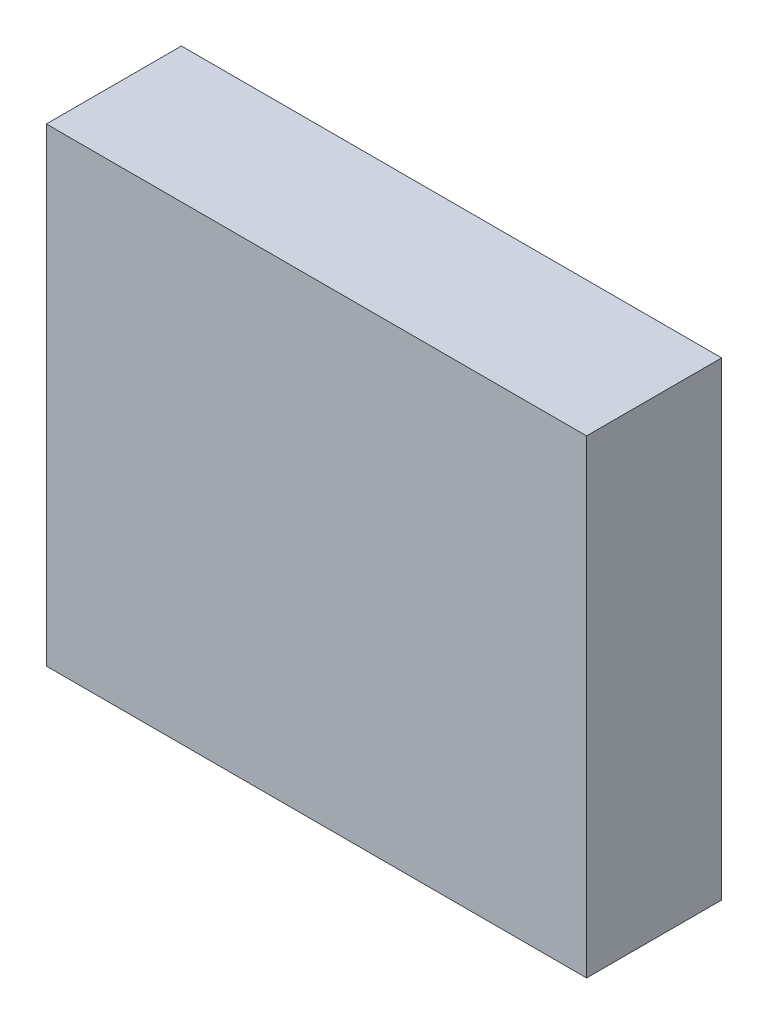
ISO-10303-21;
HEADER;
FILE_DESCRIPTION(('STEP AP214'),'2;1');
FILE_NAME('part.step','',(''),(''),'','','');
FILE_SCHEMA(('AUTOMOTIVE_DESIGN { 1 0 10303 214 1 1 1 1 }'));
ENDSEC;
DATA;
#1=APPLICATION_CONTEXT('core data for automotive mechanical design processes');
#2=APPLICATION_PROTOCOL_DEFINITION('international standard','automotive_design',2000,#1);
#3=PRODUCT_CONTEXT('',#1,'mechanical');
#4=PRODUCT('Part','Part','',(#3));
#5=PRODUCT_RELATED_PRODUCT_CATEGORY('part','',(#4));
#6=PRODUCT_DEFINITION_FORMATION('','',#4);
#7=PRODUCT_DEFINITION_CONTEXT('part definition',#1,'design');
#8=PRODUCT_DEFINITION('design','',#6,#7);
#9=PRODUCT_DEFINITION_SHAPE('','',#8);
#10=(LENGTH_UNIT() NAMED_UNIT(*) SI_UNIT(.MILLI.,.METRE.));
#11=(NAMED_UNIT(*) PLANE_ANGLE_UNIT() SI_UNIT($,.RADIAN.));
#12=(NAMED_UNIT(*) SI_UNIT($,.STERADIAN.) SOLID_ANGLE_UNIT());
#13=UNCERTAINTY_MEASURE_WITH_UNIT(LENGTH_MEASURE(1.E-05),#10,'distance_accuracy_value','');
#14=(GEOMETRIC_REPRESENTATION_CONTEXT(3) GLOBAL_UNCERTAINTY_ASSIGNED_CONTEXT((#13)) GLOBAL_UNIT_ASSIGNED_CONTEXT((#10,
#11,#12)) REPRESENTATION_CONTEXT('',''));
#15=CARTESIAN_POINT('',(0.,0.,0.));
#16=DIRECTION('',(0.,0.,1.));
#17=DIRECTION('',(1.,0.,0.));
#18=AXIS2_PLACEMENT_3D('',#15,#16,#17);
#19=CARTESIAN_POINT('',(42.,36.5,21.));
#20=DIRECTION('',(-1.,0.,0.));
#21=DIRECTION('',(0.,-1.,0.));
#22=AXIS2_PLACEMENT_3D('',#19,#20,#21);
#23=PLANE('',#22);
#24=DIRECTION('',(0.,1.,0.));
#25=VECTOR('',#24,1.);
#26=CARTESIAN_POINT('',(42.,36.5,0.));
#27=LINE('',#26,#25);
#28=CARTESIAN_POINT('',(42.,-36.5,0.));
#29=VERTEX_POINT('',#28);
#30=CARTESIAN_POINT('',(42.,36.5,0.));
#31=VERTEX_POINT('',#30);
#32=EDGE_CURVE('E104',#29,#31,#27,.T.);
#33=ORIENTED_EDGE('',*,*,#32,.T.);
#34=DIRECTION('',(0.,0.,-1.));
#35=VECTOR('',#34,1.);
#36=CARTESIAN_POINT('',(42.,36.5,21.));
#37=LINE('',#36,#35);
#38=CARTESIAN_POINT('',(42.,36.5,21.));
#39=VERTEX_POINT('',#38);
#40=EDGE_CURVE('E11',#39,#31,#37,.T.);
#41=ORIENTED_EDGE('',*,*,#40,.F.);
#42=DIRECTION('',(0.,1.,0.));
#43=VECTOR('',#42,1.);
#44=CARTESIAN_POINT('',(42.,36.5,21.));
#45=LINE('',#44,#43);
#46=CARTESIAN_POINT('',(42.,-36.5,21.));
#47=VERTEX_POINT('',#46);
#48=EDGE_CURVE('E92',#47,#39,#45,.T.);
#49=ORIENTED_EDGE('',*,*,#48,.F.);
#50=DIRECTION('',(0.,0.,-1.));
#51=VECTOR('',#50,1.);
#52=CARTESIAN_POINT('',(42.,-36.5,21.));
#53=LINE('',#52,#51);
#54=EDGE_CURVE('E100',#47,#29,#53,.T.);
#55=ORIENTED_EDGE('',*,*,#54,.T.);
#56=EDGE_LOOP('',(#33,#41,#49,#55));
#57=FACE_BOUND('',#56,.T.);
#58=ADVANCED_FACE('F41',(#57),#23,.F.);
#59=CARTESIAN_POINT('',(-42.,36.5,21.));
#60=DIRECTION('',(0.,-1.,0.));
#61=DIRECTION('',(0.,0.,-1.));
#62=AXIS2_PLACEMENT_3D('',#59,#60,#61);
#63=PLANE('',#62);
#64=DIRECTION('',(-1.,0.,0.));
#65=VECTOR('',#64,1.);
#66=CARTESIAN_POINT('',(-42.,36.5,0.));
#67=LINE('',#66,#65);
#68=CARTESIAN_POINT('',(-42.,36.5,0.));
#69=VERTEX_POINT('',#68);
#70=EDGE_CURVE('E96',#31,#69,#67,.T.);
#71=ORIENTED_EDGE('',*,*,#70,.T.);
#72=DIRECTION('',(0.,0.,-1.));
#73=VECTOR('',#72,1.);
#74=CARTESIAN_POINT('',(-42.,36.5,21.));
#75=LINE('',#74,#73);
#76=CARTESIAN_POINT('',(-42.,36.5,21.));
#77=VERTEX_POINT('',#76);
#78=EDGE_CURVE('E49',#77,#69,#75,.T.);
#79=ORIENTED_EDGE('',*,*,#78,.F.);
#80=DIRECTION('',(-1.,0.,0.));
#81=VECTOR('',#80,1.);
#82=CARTESIAN_POINT('',(-42.,36.5,21.));
#83=LINE('',#82,#81);
#84=EDGE_CURVE('E87',#39,#77,#83,.T.);
#85=ORIENTED_EDGE('',*,*,#84,.F.);
#86=ORIENTED_EDGE('',*,*,#40,.T.);
#87=EDGE_LOOP('',(#71,#79,#85,#86));
#88=FACE_BOUND('',#87,.T.);
#89=ADVANCED_FACE('F95',(#88),#63,.F.);
#90=CARTESIAN_POINT('',(-42.,36.5,21.));
#91=DIRECTION('',(1.,0.,0.));
#92=DIRECTION('',(0.,1.,0.));
#93=AXIS2_PLACEMENT_3D('',#90,#91,#92);
#94=PLANE('',#93);
#95=DIRECTION('',(0.,-1.,0.));
#96=VECTOR('',#95,1.);
#97=CARTESIAN_POINT('',(-42.,36.5,0.));
#98=LINE('',#97,#96);
#99=CARTESIAN_POINT('',(-42.,-36.5,0.));
#100=VERTEX_POINT('',#99);
#101=EDGE_CURVE('E74',#69,#100,#98,.T.);
#102=ORIENTED_EDGE('',*,*,#101,.T.);
#103=DIRECTION('',(0.,0.,-1.));
#104=VECTOR('',#103,1.);
#105=CARTESIAN_POINT('',(-42.,-36.5,21.));
#106=LINE('',#105,#104);
#107=CARTESIAN_POINT('',(-42.,-36.5,21.));
#108=VERTEX_POINT('',#107);
#109=EDGE_CURVE('E97',#108,#100,#106,.T.);
#110=ORIENTED_EDGE('',*,*,#109,.F.);
#111=DIRECTION('',(0.,-1.,0.));
#112=VECTOR('',#111,1.);
#113=CARTESIAN_POINT('',(-42.,36.5,21.));
#114=LINE('',#113,#112);
#115=EDGE_CURVE('E90',#77,#108,#114,.T.);
#116=ORIENTED_EDGE('',*,*,#115,.F.);
#117=ORIENTED_EDGE('',*,*,#78,.T.);
#118=EDGE_LOOP('',(#102,#110,#116,#117));
#119=FACE_BOUND('',#118,.T.);
#120=ADVANCED_FACE('F98',(#119),#94,.F.);
#121=CARTESIAN_POINT('',(-42.,-36.5,21.));
#122=DIRECTION('',(0.,1.,0.));
#123=DIRECTION('',(0.,0.,1.));
#124=AXIS2_PLACEMENT_3D('',#121,#122,#123);
#125=PLANE('',#124);
#126=DIRECTION('',(1.,0.,0.));
#127=VECTOR('',#126,1.);
#128=CARTESIAN_POINT('',(-42.,-36.5,0.));
#129=LINE('',#128,#127);
#130=EDGE_CURVE('E80',#100,#29,#129,.T.);
#131=ORIENTED_EDGE('',*,*,#130,.T.);
#132=ORIENTED_EDGE('',*,*,#54,.F.);
#133=DIRECTION('',(1.,0.,0.));
#134=VECTOR('',#133,1.);
#135=CARTESIAN_POINT('',(-42.,-36.5,21.));
#136=LINE('',#135,#134);
#137=EDGE_CURVE('E57',#108,#47,#136,.T.);
#138=ORIENTED_EDGE('',*,*,#137,.F.);
#139=ORIENTED_EDGE('',*,*,#109,.T.);
#140=EDGE_LOOP('',(#131,#132,#138,#139));
#141=FACE_BOUND('',#140,.T.);
#142=ADVANCED_FACE('F111',(#141),#125,.F.);
#143=CARTESIAN_POINT('',(0.,0.,21.));
#144=DIRECTION('',(0.,0.,1.));
#145=DIRECTION('',(1.,0.,0.));
#146=AXIS2_PLACEMENT_3D('',#143,#144,#145);
#147=PLANE('',#146);
#148=ORIENTED_EDGE('',*,*,#48,.T.);
#149=ORIENTED_EDGE('',*,*,#84,.T.);
#150=ORIENTED_EDGE('',*,*,#115,.T.);
#151=ORIENTED_EDGE('',*,*,#137,.T.);
#152=EDGE_LOOP('',(#148,#149,#150,#151));
#153=FACE_BOUND('',#152,.T.);
#154=ADVANCED_FACE('F88',(#153),#147,.T.);
#155=CARTESIAN_POINT('',(0.,0.,0.));
#156=DIRECTION('',(0.,0.,1.));
#157=DIRECTION('',(1.,0.,0.));
#158=AXIS2_PLACEMENT_3D('',#155,#156,#157);
#159=PLANE('',#158);
#160=ORIENTED_EDGE('',*,*,#32,.F.);
#161=ORIENTED_EDGE('',*,*,#130,.F.);
#162=ORIENTED_EDGE('',*,*,#101,.F.);
#163=ORIENTED_EDGE('',*,*,#70,.F.);
#164=EDGE_LOOP('',(#160,#161,#162,#163));
#165=FACE_BOUND('',#164,.T.);
#166=ADVANCED_FACE('F114',(#165),#159,.F.);
#167=CLOSED_SHELL('',(#58,#89,#120,#142,#154,#166));
#168=MANIFOLD_SOLID_BREP('B2',#167);
#169=ADVANCED_BREP_SHAPE_REPRESENTATION('',(#18,#168),#14);
#170=SHAPE_DEFINITION_REPRESENTATION(#9,#169);
ENDSEC;
END-ISO-10303-21;
